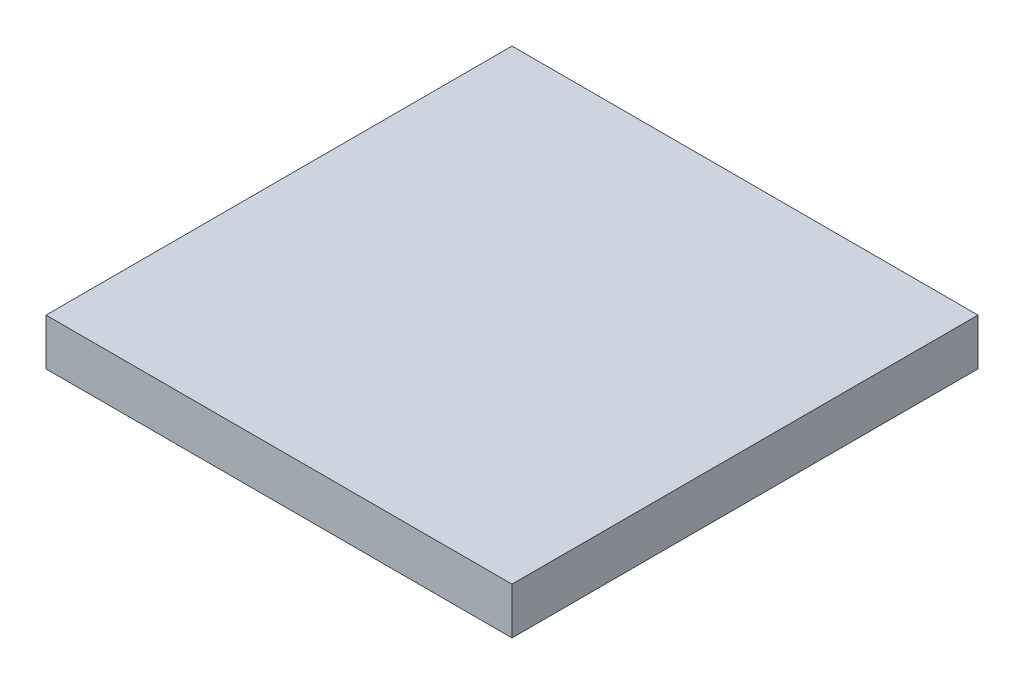
ISO-10303-21;
HEADER;
FILE_DESCRIPTION(('STEP AP214'),'2;1');
FILE_NAME('part.step','',(''),(''),'','','');
FILE_SCHEMA(('AUTOMOTIVE_DESIGN { 1 0 10303 214 1 1 1 1 }'));
ENDSEC;
DATA;
#1=APPLICATION_CONTEXT('core data for automotive mechanical design processes');
#2=APPLICATION_PROTOCOL_DEFINITION('international standard','automotive_design',2000,#1);
#3=PRODUCT_CONTEXT('',#1,'mechanical');
#4=PRODUCT('Part','Part','',(#3));
#5=PRODUCT_RELATED_PRODUCT_CATEGORY('part','',(#4));
#6=PRODUCT_DEFINITION_FORMATION('','',#4);
#7=PRODUCT_DEFINITION_CONTEXT('part definition',#1,'design');
#8=PRODUCT_DEFINITION('design','',#6,#7);
#9=PRODUCT_DEFINITION_SHAPE('','',#8);
#10=(LENGTH_UNIT() NAMED_UNIT(*) SI_UNIT(.MILLI.,.METRE.));
#11=(NAMED_UNIT(*) PLANE_ANGLE_UNIT() SI_UNIT($,.RADIAN.));
#12=(NAMED_UNIT(*) SI_UNIT($,.STERADIAN.) SOLID_ANGLE_UNIT());
#13=UNCERTAINTY_MEASURE_WITH_UNIT(LENGTH_MEASURE(1.E-05),#10,'distance_accuracy_value','');
#14=(GEOMETRIC_REPRESENTATION_CONTEXT(3) GLOBAL_UNCERTAINTY_ASSIGNED_CONTEXT((#13)) GLOBAL_UNIT_ASSIGNED_CONTEXT((#10,
#11,#12)) REPRESENTATION_CONTEXT('',''));
#15=CARTESIAN_POINT('',(0.,0.,0.));
#16=DIRECTION('',(0.,0.,1.));
#17=DIRECTION('',(1.,0.,0.));
#18=AXIS2_PLACEMENT_3D('',#15,#16,#17);
#19=CARTESIAN_POINT('',(0.,0.5,0.));
#20=DIRECTION('',(1.,0.,0.));
#21=DIRECTION('',(0.,0.,-1.));
#22=AXIS2_PLACEMENT_3D('',#19,#20,#21);
#23=PLANE('',#22);
#24=DIRECTION('',(0.,0.,1.));
#25=VECTOR('',#24,1.);
#26=CARTESIAN_POINT('',(0.,0.,0.));
#27=LINE('',#26,#25);
#28=CARTESIAN_POINT('',(0.,0.,-5.));
#29=VERTEX_POINT('',#28);
#30=CARTESIAN_POINT('',(0.,0.,0.));
#31=VERTEX_POINT('',#30);
#32=EDGE_CURVE('E96',#29,#31,#27,.T.);
#33=ORIENTED_EDGE('',*,*,#32,.T.);
#34=DIRECTION('',(0.,-1.,0.));
#35=VECTOR('',#34,1.);
#36=CARTESIAN_POINT('',(0.,0.5,0.));
#37=LINE('',#36,#35);
#38=CARTESIAN_POINT('',(0.,0.5,0.));
#39=VERTEX_POINT('',#38);
#40=EDGE_CURVE('E11',#39,#31,#37,.T.);
#41=ORIENTED_EDGE('',*,*,#40,.F.);
#42=DIRECTION('',(0.,0.,1.));
#43=VECTOR('',#42,1.);
#44=CARTESIAN_POINT('',(0.,0.5,0.));
#45=LINE('',#44,#43);
#46=CARTESIAN_POINT('',(0.,0.5,-5.));
#47=VERTEX_POINT('',#46);
#48=EDGE_CURVE('E84',#47,#39,#45,.T.);
#49=ORIENTED_EDGE('',*,*,#48,.F.);
#50=DIRECTION('',(0.,-1.,0.));
#51=VECTOR('',#50,1.);
#52=CARTESIAN_POINT('',(0.,0.5,-5.));
#53=LINE('',#52,#51);
#54=EDGE_CURVE('E92',#47,#29,#53,.T.);
#55=ORIENTED_EDGE('',*,*,#54,.T.);
#56=EDGE_LOOP('',(#33,#41,#49,#55));
#57=FACE_BOUND('',#56,.T.);
#58=ADVANCED_FACE('F33',(#57),#23,.F.);
#59=CARTESIAN_POINT('',(0.,0.5,0.));
#60=DIRECTION('',(0.,0.,-1.));
#61=DIRECTION('',(-1.,0.,0.));
#62=AXIS2_PLACEMENT_3D('',#59,#60,#61);
#63=PLANE('',#62);
#64=DIRECTION('',(1.,0.,0.));
#65=VECTOR('',#64,1.);
#66=CARTESIAN_POINT('',(0.,0.,0.));
#67=LINE('',#66,#65);
#68=CARTESIAN_POINT('',(5.,0.,0.));
#69=VERTEX_POINT('',#68);
#70=EDGE_CURVE('E88',#31,#69,#67,.T.);
#71=ORIENTED_EDGE('',*,*,#70,.T.);
#72=DIRECTION('',(0.,-1.,0.));
#73=VECTOR('',#72,1.);
#74=CARTESIAN_POINT('',(5.,0.5,0.));
#75=LINE('',#74,#73);
#76=CARTESIAN_POINT('',(5.,0.5,0.));
#77=VERTEX_POINT('',#76);
#78=EDGE_CURVE('E41',#77,#69,#75,.T.);
#79=ORIENTED_EDGE('',*,*,#78,.F.);
#80=DIRECTION('',(1.,0.,0.));
#81=VECTOR('',#80,1.);
#82=CARTESIAN_POINT('',(0.,0.5,0.));
#83=LINE('',#82,#81);
#84=EDGE_CURVE('E79',#39,#77,#83,.T.);
#85=ORIENTED_EDGE('',*,*,#84,.F.);
#86=ORIENTED_EDGE('',*,*,#40,.T.);
#87=EDGE_LOOP('',(#71,#79,#85,#86));
#88=FACE_BOUND('',#87,.T.);
#89=ADVANCED_FACE('F87',(#88),#63,.F.);
#90=CARTESIAN_POINT('',(5.,0.5,0.));
#91=DIRECTION('',(-1.,0.,0.));
#92=DIRECTION('',(0.,0.,1.));
#93=AXIS2_PLACEMENT_3D('',#90,#91,#92);
#94=PLANE('',#93);
#95=DIRECTION('',(0.,0.,-1.));
#96=VECTOR('',#95,1.);
#97=CARTESIAN_POINT('',(5.,0.,0.));
#98=LINE('',#97,#96);
#99=CARTESIAN_POINT('',(5.,0.,-5.));
#100=VERTEX_POINT('',#99);
#101=EDGE_CURVE('E66',#69,#100,#98,.T.);
#102=ORIENTED_EDGE('',*,*,#101,.T.);
#103=DIRECTION('',(0.,-1.,0.));
#104=VECTOR('',#103,1.);
#105=CARTESIAN_POINT('',(5.,0.5,-5.));
#106=LINE('',#105,#104);
#107=CARTESIAN_POINT('',(5.,0.5,-5.));
#108=VERTEX_POINT('',#107);
#109=EDGE_CURVE('E89',#108,#100,#106,.T.);
#110=ORIENTED_EDGE('',*,*,#109,.F.);
#111=DIRECTION('',(0.,0.,-1.));
#112=VECTOR('',#111,1.);
#113=CARTESIAN_POINT('',(5.,0.5,0.));
#114=LINE('',#113,#112);
#115=EDGE_CURVE('E82',#77,#108,#114,.T.);
#116=ORIENTED_EDGE('',*,*,#115,.F.);
#117=ORIENTED_EDGE('',*,*,#78,.T.);
#118=EDGE_LOOP('',(#102,#110,#116,#117));
#119=FACE_BOUND('',#118,.T.);
#120=ADVANCED_FACE('F90',(#119),#94,.F.);
#121=CARTESIAN_POINT('',(0.,0.5,-5.));
#122=DIRECTION('',(0.,0.,1.));
#123=DIRECTION('',(1.,0.,0.));
#124=AXIS2_PLACEMENT_3D('',#121,#122,#123);
#125=PLANE('',#124);
#126=DIRECTION('',(-1.,0.,0.));
#127=VECTOR('',#126,1.);
#128=CARTESIAN_POINT('',(0.,0.,-5.));
#129=LINE('',#128,#127);
#130=EDGE_CURVE('E72',#100,#29,#129,.T.);
#131=ORIENTED_EDGE('',*,*,#130,.T.);
#132=ORIENTED_EDGE('',*,*,#54,.F.);
#133=DIRECTION('',(-1.,0.,0.));
#134=VECTOR('',#133,1.);
#135=CARTESIAN_POINT('',(0.,0.5,-5.));
#136=LINE('',#135,#134);
#137=EDGE_CURVE('E49',#108,#47,#136,.T.);
#138=ORIENTED_EDGE('',*,*,#137,.F.);
#139=ORIENTED_EDGE('',*,*,#109,.T.);
#140=EDGE_LOOP('',(#131,#132,#138,#139));
#141=FACE_BOUND('',#140,.T.);
#142=ADVANCED_FACE('F103',(#141),#125,.F.);
#143=CARTESIAN_POINT('',(0.,0.5,0.));
#144=DIRECTION('',(0.,-1.,0.));
#145=DIRECTION('',(0.,0.,-1.));
#146=AXIS2_PLACEMENT_3D('',#143,#144,#145);
#147=PLANE('',#146);
#148=ORIENTED_EDGE('',*,*,#48,.T.);
#149=ORIENTED_EDGE('',*,*,#84,.T.);
#150=ORIENTED_EDGE('',*,*,#115,.T.);
#151=ORIENTED_EDGE('',*,*,#137,.T.);
#152=EDGE_LOOP('',(#148,#149,#150,#151));
#153=FACE_BOUND('',#152,.T.);
#154=ADVANCED_FACE('F80',(#153),#147,.F.);
#155=CARTESIAN_POINT('',(0.,0.,0.));
#156=DIRECTION('',(0.,-1.,0.));
#157=DIRECTION('',(0.,0.,-1.));
#158=AXIS2_PLACEMENT_3D('',#155,#156,#157);
#159=PLANE('',#158);
#160=ORIENTED_EDGE('',*,*,#32,.F.);
#161=ORIENTED_EDGE('',*,*,#130,.F.);
#162=ORIENTED_EDGE('',*,*,#101,.F.);
#163=ORIENTED_EDGE('',*,*,#70,.F.);
#164=EDGE_LOOP('',(#160,#161,#162,#163));
#165=FACE_BOUND('',#164,.T.);
#166=ADVANCED_FACE('F106',(#165),#159,.T.);
#167=CLOSED_SHELL('',(#58,#89,#120,#142,#154,#166));
#168=MANIFOLD_SOLID_BREP('B2',#167);
#169=ADVANCED_BREP_SHAPE_REPRESENTATION('',(#18,#168),#14);
#170=SHAPE_DEFINITION_REPRESENTATION(#9,#169);
ENDSEC;
END-ISO-10303-21;
